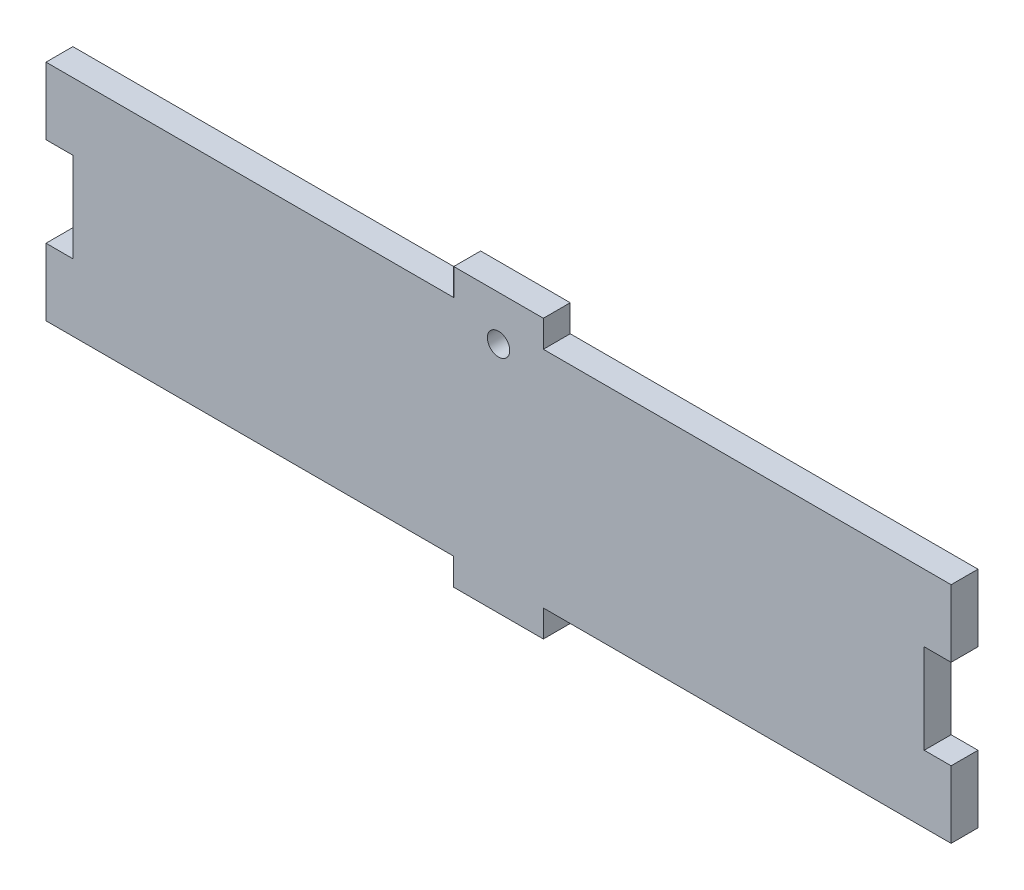
ISO-10303-21;
HEADER;
FILE_DESCRIPTION(('STEP AP214'),'2;1');
FILE_NAME('part.step','',(''),(''),'','','');
FILE_SCHEMA(('AUTOMOTIVE_DESIGN { 1 0 10303 214 1 1 1 1 }'));
ENDSEC;
DATA;
#1=APPLICATION_CONTEXT('core data for automotive mechanical design processes');
#2=APPLICATION_PROTOCOL_DEFINITION('international standard','automotive_design',2000,#1);
#3=PRODUCT_CONTEXT('',#1,'mechanical');
#4=PRODUCT('Part','Part','',(#3));
#5=PRODUCT_RELATED_PRODUCT_CATEGORY('part','',(#4));
#6=PRODUCT_DEFINITION_FORMATION('','',#4);
#7=PRODUCT_DEFINITION_CONTEXT('part definition',#1,'design');
#8=PRODUCT_DEFINITION('design','',#6,#7);
#9=PRODUCT_DEFINITION_SHAPE('','',#8);
#10=(LENGTH_UNIT() NAMED_UNIT(*) SI_UNIT(.MILLI.,.METRE.));
#11=(NAMED_UNIT(*) PLANE_ANGLE_UNIT() SI_UNIT($,.RADIAN.));
#12=(NAMED_UNIT(*) SI_UNIT($,.STERADIAN.) SOLID_ANGLE_UNIT());
#13=UNCERTAINTY_MEASURE_WITH_UNIT(LENGTH_MEASURE(1.E-05),#10,'distance_accuracy_value','');
#14=(GEOMETRIC_REPRESENTATION_CONTEXT(3) GLOBAL_UNCERTAINTY_ASSIGNED_CONTEXT((#13)) GLOBAL_UNIT_ASSIGNED_CONTEXT((#10,
#11,#12)) REPRESENTATION_CONTEXT('',''));
#15=CARTESIAN_POINT('',(0.,0.,0.));
#16=DIRECTION('',(0.,0.,1.));
#17=DIRECTION('',(1.,0.,0.));
#18=AXIS2_PLACEMENT_3D('',#15,#16,#17);
#19=CARTESIAN_POINT('',(-92.9969219106056,-12.7041554206809,-6.));
#20=DIRECTION('',(-1.,0.,0.));
#21=DIRECTION('',(0.,0.,1.));
#22=AXIS2_PLACEMENT_3D('',#19,#20,#21);
#23=PLANE('',#22);
#24=DIRECTION('',(0.,0.,1.));
#25=VECTOR('',#24,1.);
#26=CARTESIAN_POINT('',(-92.9969219106056,7.29584457931905,-6.));
#27=LINE('',#26,#25);
#28=CARTESIAN_POINT('',(-92.9969219106056,7.29584457931905,-6.));
#29=VERTEX_POINT('',#28);
#30=CARTESIAN_POINT('',(-92.9969219106056,7.29584457931905,0.));
#31=VERTEX_POINT('',#30);
#32=EDGE_CURVE('E191',#29,#31,#27,.T.);
#33=ORIENTED_EDGE('',*,*,#32,.F.);
#34=DIRECTION('',(0.,-1.,0.));
#35=VECTOR('',#34,1.);
#36=CARTESIAN_POINT('',(-92.9969219106056,22.2958445793191,-6.));
#37=LINE('',#36,#35);
#38=CARTESIAN_POINT('',(-92.9969219106056,-12.7041554206809,-6.));
#39=VERTEX_POINT('',#38);
#40=EDGE_CURVE('E49',#29,#39,#37,.T.);
#41=ORIENTED_EDGE('',*,*,#40,.T.);
#42=DIRECTION('',(0.,0.,1.));
#43=VECTOR('',#42,1.);
#44=CARTESIAN_POINT('',(-92.9969219106056,-12.7041554206809,-6.));
#45=LINE('',#44,#43);
#46=CARTESIAN_POINT('',(-92.9969219106056,-12.7041554206809,0.));
#47=VERTEX_POINT('',#46);
#48=EDGE_CURVE('E230',#39,#47,#45,.T.);
#49=ORIENTED_EDGE('',*,*,#48,.T.);
#50=DIRECTION('',(0.,-1.,0.));
#51=VECTOR('',#50,1.);
#52=CARTESIAN_POINT('',(-92.9969219106056,-12.7041554206809,0.));
#53=LINE('',#52,#51);
#54=EDGE_CURVE('E68',#31,#47,#53,.T.);
#55=ORIENTED_EDGE('',*,*,#54,.F.);
#56=EDGE_LOOP('',(#33,#41,#49,#55));
#57=FACE_BOUND('',#56,.T.);
#58=ADVANCED_FACE('F46',(#57),#23,.T.);
#59=CARTESIAN_POINT('',(97.0030780893944,-27.7041554206809,-6.));
#60=DIRECTION('',(0.,-1.,0.));
#61=DIRECTION('',(0.,0.,-1.));
#62=AXIS2_PLACEMENT_3D('',#59,#60,#61);
#63=PLANE('',#62);
#64=DIRECTION('',(1.,0.,0.));
#65=VECTOR('',#64,1.);
#66=CARTESIAN_POINT('',(-7.99692191060568,-27.7041554206809,-6.));
#67=LINE('',#66,#65);
#68=CARTESIAN_POINT('',(-98.9969219106057,-27.7041554206809,-6.));
#69=VERTEX_POINT('',#68);
#70=CARTESIAN_POINT('',(-7.99692191060568,-27.7041554206809,-6.));
#71=VERTEX_POINT('',#70);
#72=EDGE_CURVE('E55',#69,#71,#67,.T.);
#73=ORIENTED_EDGE('',*,*,#72,.T.);
#74=DIRECTION('',(0.,0.,1.));
#75=VECTOR('',#74,1.);
#76=CARTESIAN_POINT('',(-7.99692191060568,-27.7041554206809,-6.));
#77=LINE('',#76,#75);
#78=CARTESIAN_POINT('',(-7.99692191060568,-27.7041554206809,0.));
#79=VERTEX_POINT('',#78);
#80=EDGE_CURVE('E401',#71,#79,#77,.T.);
#81=ORIENTED_EDGE('',*,*,#80,.T.);
#82=DIRECTION('',(1.,0.,0.));
#83=VECTOR('',#82,1.);
#84=CARTESIAN_POINT('',(97.0030780893944,-27.7041554206809,0.));
#85=LINE('',#84,#83);
#86=CARTESIAN_POINT('',(-98.9969219106057,-27.7041554206809,0.));
#87=VERTEX_POINT('',#86);
#88=EDGE_CURVE('E256',#87,#79,#85,.T.);
#89=ORIENTED_EDGE('',*,*,#88,.F.);
#90=DIRECTION('',(0.,0.,1.));
#91=VECTOR('',#90,1.);
#92=CARTESIAN_POINT('',(-98.9969219106057,-27.7041554206809,-6.));
#93=LINE('',#92,#91);
#94=EDGE_CURVE('E227',#69,#87,#93,.T.);
#95=ORIENTED_EDGE('',*,*,#94,.F.);
#96=EDGE_LOOP('',(#73,#81,#89,#95));
#97=FACE_BOUND('',#96,.T.);
#98=ADVANCED_FACE('F425',(#97),#63,.T.);
#99=CARTESIAN_POINT('',(97.0030780893944,7.29584457931905,-6.));
#100=DIRECTION('',(1.,0.,0.));
#101=DIRECTION('',(0.,0.,-1.));
#102=AXIS2_PLACEMENT_3D('',#99,#100,#101);
#103=PLANE('',#102);
#104=DIRECTION('',(0.,0.,1.));
#105=VECTOR('',#104,1.);
#106=CARTESIAN_POINT('',(97.0030780893944,-12.7041554206809,-6.));
#107=LINE('',#106,#105);
#108=CARTESIAN_POINT('',(97.0030780893944,-12.7041554206809,-6.));
#109=VERTEX_POINT('',#108);
#110=CARTESIAN_POINT('',(97.0030780893944,-12.7041554206809,0.));
#111=VERTEX_POINT('',#110);
#112=EDGE_CURVE('E327',#109,#111,#107,.T.);
#113=ORIENTED_EDGE('',*,*,#112,.F.);
#114=DIRECTION('',(0.,1.,0.));
#115=VECTOR('',#114,1.);
#116=CARTESIAN_POINT('',(97.0030780893944,-27.7041554206809,-6.));
#117=LINE('',#116,#115);
#118=CARTESIAN_POINT('',(97.0030780893944,7.29584457931905,-6.));
#119=VERTEX_POINT('',#118);
#120=EDGE_CURVE('E13',#109,#119,#117,.T.);
#121=ORIENTED_EDGE('',*,*,#120,.T.);
#122=DIRECTION('',(0.,0.,1.));
#123=VECTOR('',#122,1.);
#124=CARTESIAN_POINT('',(97.0030780893944,7.29584457931905,-6.));
#125=LINE('',#124,#123);
#126=CARTESIAN_POINT('',(97.0030780893944,7.29584457931905,0.));
#127=VERTEX_POINT('',#126);
#128=EDGE_CURVE('E269',#119,#127,#125,.T.);
#129=ORIENTED_EDGE('',*,*,#128,.T.);
#130=DIRECTION('',(0.,1.,0.));
#131=VECTOR('',#130,1.);
#132=CARTESIAN_POINT('',(97.0030780893944,7.29584457931905,0.));
#133=LINE('',#132,#131);
#134=EDGE_CURVE('E258',#111,#127,#133,.T.);
#135=ORIENTED_EDGE('',*,*,#134,.F.);
#136=EDGE_LOOP('',(#113,#121,#129,#135));
#137=FACE_BOUND('',#136,.T.);
#138=ADVANCED_FACE('F450',(#137),#103,.T.);
#139=CARTESIAN_POINT('',(12.0030780893943,22.2958445793191,-6.));
#140=DIRECTION('',(0.,1.,0.));
#141=DIRECTION('',(0.,0.,1.));
#142=AXIS2_PLACEMENT_3D('',#139,#140,#141);
#143=PLANE('',#142);
#144=DIRECTION('',(-1.,0.,0.));
#145=VECTOR('',#144,1.);
#146=CARTESIAN_POINT('',(-92.9969219106056,22.2958445793191,-6.));
#147=LINE('',#146,#145);
#148=CARTESIAN_POINT('',(103.003078089394,22.2958445793191,-6.));
#149=VERTEX_POINT('',#148);
#150=CARTESIAN_POINT('',(12.0030780893943,22.2958445793191,-6.));
#151=VERTEX_POINT('',#150);
#152=EDGE_CURVE('E355',#149,#151,#147,.T.);
#153=ORIENTED_EDGE('',*,*,#152,.T.);
#154=DIRECTION('',(0.,0.,1.));
#155=VECTOR('',#154,1.);
#156=CARTESIAN_POINT('',(12.0030780893943,22.2958445793191,-6.));
#157=LINE('',#156,#155);
#158=CARTESIAN_POINT('',(12.0030780893943,22.2958445793191,0.));
#159=VERTEX_POINT('',#158);
#160=EDGE_CURVE('E242',#151,#159,#157,.T.);
#161=ORIENTED_EDGE('',*,*,#160,.T.);
#162=DIRECTION('',(-1.,0.,0.));
#163=VECTOR('',#162,1.);
#164=CARTESIAN_POINT('',(12.0030780893943,22.2958445793191,0.));
#165=LINE('',#164,#163);
#166=CARTESIAN_POINT('',(103.003078089394,22.2958445793191,0.));
#167=VERTEX_POINT('',#166);
#168=EDGE_CURVE('E351',#167,#159,#165,.T.);
#169=ORIENTED_EDGE('',*,*,#168,.F.);
#170=DIRECTION('',(0.,0.,1.));
#171=VECTOR('',#170,1.);
#172=CARTESIAN_POINT('',(103.003078089394,22.2958445793191,-6.));
#173=LINE('',#172,#171);
#174=EDGE_CURVE('E337',#149,#167,#173,.T.);
#175=ORIENTED_EDGE('',*,*,#174,.F.);
#176=EDGE_LOOP('',(#153,#161,#169,#175));
#177=FACE_BOUND('',#176,.T.);
#178=ADVANCED_FACE('F453',(#177),#143,.T.);
#179=DIRECTION('',(0.,0.,1.));
#180=VECTOR('',#179,1.);
#181=CARTESIAN_POINT('',(-7.99692191060566,22.2958445793191,-6.));
#182=LINE('',#181,#180);
#183=CARTESIAN_POINT('',(-7.99692191060566,22.2958445793191,-6.));
#184=VERTEX_POINT('',#183);
#185=CARTESIAN_POINT('',(-7.99692191060566,22.2958445793191,0.));
#186=VERTEX_POINT('',#185);
#187=EDGE_CURVE('E298',#184,#186,#182,.T.);
#188=ORIENTED_EDGE('',*,*,#187,.F.);
#189=CARTESIAN_POINT('',(-98.9969219106057,22.2958445793191,-6.));
#190=VERTEX_POINT('',#189);
#191=EDGE_CURVE('E353',#184,#190,#147,.T.);
#192=ORIENTED_EDGE('',*,*,#191,.T.);
#193=DIRECTION('',(0.,0.,1.));
#194=VECTOR('',#193,1.);
#195=CARTESIAN_POINT('',(-98.9969219106057,22.2958445793191,-6.));
#196=LINE('',#195,#194);
#197=CARTESIAN_POINT('',(-98.9969219106057,22.2958445793191,0.));
#198=VERTEX_POINT('',#197);
#199=EDGE_CURVE('E204',#190,#198,#196,.T.);
#200=ORIENTED_EDGE('',*,*,#199,.T.);
#201=EDGE_CURVE('E261',#186,#198,#165,.T.);
#202=ORIENTED_EDGE('',*,*,#201,.F.);
#203=EDGE_LOOP('',(#188,#192,#200,#202));
#204=FACE_BOUND('',#203,.T.);
#205=ADVANCED_FACE('F455',(#204),#143,.T.);
#206=DIRECTION('',(0.,0.,1.));
#207=VECTOR('',#206,1.);
#208=CARTESIAN_POINT('',(12.0030780893943,-27.7041554206809,-6.));
#209=LINE('',#208,#207);
#210=CARTESIAN_POINT('',(12.0030780893943,-27.7041554206809,-6.));
#211=VERTEX_POINT('',#210);
#212=CARTESIAN_POINT('',(12.0030780893943,-27.7041554206809,0.));
#213=VERTEX_POINT('',#212);
#214=EDGE_CURVE('E409',#211,#213,#209,.T.);
#215=ORIENTED_EDGE('',*,*,#214,.F.);
#216=CARTESIAN_POINT('',(103.003078089394,-27.7041554206809,-6.));
#217=VERTEX_POINT('',#216);
#218=EDGE_CURVE('E369',#211,#217,#67,.T.);
#219=ORIENTED_EDGE('',*,*,#218,.T.);
#220=DIRECTION('',(0.,0.,1.));
#221=VECTOR('',#220,1.);
#222=CARTESIAN_POINT('',(103.003078089394,-27.7041554206809,-6.));
#223=LINE('',#222,#221);
#224=CARTESIAN_POINT('',(103.003078089394,-27.7041554206809,0.));
#225=VERTEX_POINT('',#224);
#226=EDGE_CURVE('E320',#217,#225,#223,.T.);
#227=ORIENTED_EDGE('',*,*,#226,.T.);
#228=EDGE_CURVE('E241',#213,#225,#85,.T.);
#229=ORIENTED_EDGE('',*,*,#228,.F.);
#230=EDGE_LOOP('',(#215,#219,#227,#229));
#231=FACE_BOUND('',#230,.T.);
#232=ADVANCED_FACE('F437',(#231),#63,.T.);
#233=CARTESIAN_POINT('',(0.,0.,-6.));
#234=DIRECTION('',(0.,0.,1.));
#235=DIRECTION('',(1.,0.,0.));
#236=AXIS2_PLACEMENT_3D('',#233,#234,#235);
#237=PLANE('',#236);
#238=CARTESIAN_POINT('',(2.0030780893944,18.2958445793191,-6.));
#239=DIRECTION('',(0.,0.,1.));
#240=DIRECTION('',(1.,0.,0.));
#241=AXIS2_PLACEMENT_3D('',#238,#239,#240);
#242=CIRCLE('',#241,2.5);
#243=CARTESIAN_POINT('',(4.5030780893944,18.2958445793191,-6.));
#244=VERTEX_POINT('',#243);
#245=EDGE_CURVE('E212',#244,#244,#242,.T.);
#246=ORIENTED_EDGE('',*,*,#245,.T.);
#247=EDGE_LOOP('',(#246));
#248=FACE_BOUND('',#247,.T.);
#249=ORIENTED_EDGE('',*,*,#152,.F.);
#250=DIRECTION('',(0.,1.,0.));
#251=VECTOR('',#250,1.);
#252=CARTESIAN_POINT('',(103.003078089394,7.29584457931905,-6.));
#253=LINE('',#252,#251);
#254=CARTESIAN_POINT('',(103.003078089394,7.29584457931905,-6.));
#255=VERTEX_POINT('',#254);
#256=EDGE_CURVE('E267',#255,#149,#253,.T.);
#257=ORIENTED_EDGE('',*,*,#256,.F.);
#258=DIRECTION('',(1.,0.,0.));
#259=VECTOR('',#258,1.);
#260=CARTESIAN_POINT('',(97.0030780893944,7.29584457931905,-6.));
#261=LINE('',#260,#259);
#262=EDGE_CURVE('E264',#119,#255,#261,.T.);
#263=ORIENTED_EDGE('',*,*,#262,.F.);
#264=ORIENTED_EDGE('',*,*,#120,.F.);
#265=DIRECTION('',(-1.,0.,0.));
#266=VECTOR('',#265,1.);
#267=CARTESIAN_POINT('',(103.003078089394,-12.7041554206809,-6.));
#268=LINE('',#267,#266);
#269=CARTESIAN_POINT('',(103.003078089394,-12.7041554206809,-6.));
#270=VERTEX_POINT('',#269);
#271=EDGE_CURVE('E440',#270,#109,#268,.T.);
#272=ORIENTED_EDGE('',*,*,#271,.F.);
#273=DIRECTION('',(0.,1.,0.));
#274=VECTOR('',#273,1.);
#275=CARTESIAN_POINT('',(103.003078089394,-27.7041554206809,-6.));
#276=LINE('',#275,#274);
#277=EDGE_CURVE('E335',#217,#270,#276,.T.);
#278=ORIENTED_EDGE('',*,*,#277,.F.);
#279=ORIENTED_EDGE('',*,*,#218,.F.);
#280=DIRECTION('',(0.,1.,0.));
#281=VECTOR('',#280,1.);
#282=CARTESIAN_POINT('',(12.0030780893943,-33.7041554206809,-6.));
#283=LINE('',#282,#281);
#284=CARTESIAN_POINT('',(12.0030780893943,-33.7041554206809,-6.));
#285=VERTEX_POINT('',#284);
#286=EDGE_CURVE('E393',#285,#211,#283,.T.);
#287=ORIENTED_EDGE('',*,*,#286,.F.);
#288=DIRECTION('',(1.,0.,0.));
#289=VECTOR('',#288,1.);
#290=CARTESIAN_POINT('',(-7.99692191060568,-33.7041554206809,-6.));
#291=LINE('',#290,#289);
#292=CARTESIAN_POINT('',(-7.99692191060568,-33.7041554206809,-6.));
#293=VERTEX_POINT('',#292);
#294=EDGE_CURVE('E390',#293,#285,#291,.T.);
#295=ORIENTED_EDGE('',*,*,#294,.F.);
#296=DIRECTION('',(0.,-1.,0.));
#297=VECTOR('',#296,1.);
#298=CARTESIAN_POINT('',(-7.99692191060568,-27.7041554206809,-6.));
#299=LINE('',#298,#297);
#300=EDGE_CURVE('E411',#71,#293,#299,.T.);
#301=ORIENTED_EDGE('',*,*,#300,.F.);
#302=ORIENTED_EDGE('',*,*,#72,.F.);
#303=DIRECTION('',(0.,-1.,0.));
#304=VECTOR('',#303,1.);
#305=CARTESIAN_POINT('',(-98.9969219106057,-12.7041554206809,-6.));
#306=LINE('',#305,#304);
#307=CARTESIAN_POINT('',(-98.9969219106057,-12.7041554206809,-6.));
#308=VERTEX_POINT('',#307);
#309=EDGE_CURVE('E217',#308,#69,#306,.T.);
#310=ORIENTED_EDGE('',*,*,#309,.F.);
#311=DIRECTION('',(-1.,0.,0.));
#312=VECTOR('',#311,1.);
#313=CARTESIAN_POINT('',(-92.9969219106056,-12.7041554206809,-6.));
#314=LINE('',#313,#312);
#315=EDGE_CURVE('E221',#39,#308,#314,.T.);
#316=ORIENTED_EDGE('',*,*,#315,.F.);
#317=ORIENTED_EDGE('',*,*,#40,.F.);
#318=DIRECTION('',(1.,0.,0.));
#319=VECTOR('',#318,1.);
#320=CARTESIAN_POINT('',(-98.9969219106057,7.29584457931905,-6.));
#321=LINE('',#320,#319);
#322=CARTESIAN_POINT('',(-98.9969219106057,7.29584457931905,-6.));
#323=VERTEX_POINT('',#322);
#324=EDGE_CURVE('E186',#323,#29,#321,.T.);
#325=ORIENTED_EDGE('',*,*,#324,.F.);
#326=DIRECTION('',(0.,-1.,0.));
#327=VECTOR('',#326,1.);
#328=CARTESIAN_POINT('',(-98.9969219106057,22.2958445793191,-6.));
#329=LINE('',#328,#327);
#330=EDGE_CURVE('E198',#190,#323,#329,.T.);
#331=ORIENTED_EDGE('',*,*,#330,.F.);
#332=ORIENTED_EDGE('',*,*,#191,.F.);
#333=DIRECTION('',(0.,-1.,0.));
#334=VECTOR('',#333,1.);
#335=CARTESIAN_POINT('',(-7.99692191060565,28.2958445793191,-6.));
#336=LINE('',#335,#334);
#337=CARTESIAN_POINT('',(-7.99692191060565,28.2958445793191,-6.));
#338=VERTEX_POINT('',#337);
#339=EDGE_CURVE('E283',#338,#184,#336,.T.);
#340=ORIENTED_EDGE('',*,*,#339,.F.);
#341=DIRECTION('',(-1.,0.,0.));
#342=VECTOR('',#341,1.);
#343=CARTESIAN_POINT('',(12.0030780893943,28.2958445793191,-6.));
#344=LINE('',#343,#342);
#345=CARTESIAN_POINT('',(12.0030780893943,28.2958445793191,-6.));
#346=VERTEX_POINT('',#345);
#347=EDGE_CURVE('E280',#346,#338,#344,.T.);
#348=ORIENTED_EDGE('',*,*,#347,.F.);
#349=DIRECTION('',(0.,1.,0.));
#350=VECTOR('',#349,1.);
#351=CARTESIAN_POINT('',(12.0030780893943,22.2958445793191,-6.));
#352=LINE('',#351,#350);
#353=EDGE_CURVE('E284',#151,#346,#352,.T.);
#354=ORIENTED_EDGE('',*,*,#353,.F.);
#355=EDGE_LOOP('',(#249,#257,#263,#264,#272,#278,#279,#287,#295,#301,#302,#310,#316,#317,#325,
#331,#332,#340,#348,#354));
#356=FACE_BOUND('',#355,.T.);
#357=ADVANCED_FACE('F196',(#248,#356),#237,.F.);
#358=CARTESIAN_POINT('',(0.,0.,0.));
#359=DIRECTION('',(0.,0.,1.));
#360=DIRECTION('',(1.,0.,0.));
#361=AXIS2_PLACEMENT_3D('',#358,#359,#360);
#362=PLANE('',#361);
#363=CARTESIAN_POINT('',(2.0030780893944,18.2958445793191,0.));
#364=DIRECTION('',(0.,0.,1.));
#365=DIRECTION('',(1.,0.,0.));
#366=AXIS2_PLACEMENT_3D('',#363,#364,#365);
#367=CIRCLE('',#366,2.5);
#368=CARTESIAN_POINT('',(4.5030780893944,18.2958445793191,0.));
#369=VERTEX_POINT('',#368);
#370=EDGE_CURVE('E209',#369,#369,#367,.T.);
#371=ORIENTED_EDGE('',*,*,#370,.F.);
#372=EDGE_LOOP('',(#371));
#373=FACE_BOUND('',#372,.T.);
#374=ORIENTED_EDGE('',*,*,#168,.T.);
#375=DIRECTION('',(0.,1.,0.));
#376=VECTOR('',#375,1.);
#377=CARTESIAN_POINT('',(12.0030780893943,22.2958445793191,0.));
#378=LINE('',#377,#376);
#379=CARTESIAN_POINT('',(12.0030780893943,28.2958445793191,0.));
#380=VERTEX_POINT('',#379);
#381=EDGE_CURVE('E289',#159,#380,#378,.T.);
#382=ORIENTED_EDGE('',*,*,#381,.T.);
#383=DIRECTION('',(-1.,0.,0.));
#384=VECTOR('',#383,1.);
#385=CARTESIAN_POINT('',(12.0030780893943,28.2958445793191,0.));
#386=LINE('',#385,#384);
#387=CARTESIAN_POINT('',(-7.99692191060565,28.2958445793191,0.));
#388=VERTEX_POINT('',#387);
#389=EDGE_CURVE('E285',#380,#388,#386,.T.);
#390=ORIENTED_EDGE('',*,*,#389,.T.);
#391=DIRECTION('',(0.,-1.,0.));
#392=VECTOR('',#391,1.);
#393=CARTESIAN_POINT('',(-7.99692191060565,28.2958445793191,0.));
#394=LINE('',#393,#392);
#395=EDGE_CURVE('E288',#388,#186,#394,.T.);
#396=ORIENTED_EDGE('',*,*,#395,.T.);
#397=ORIENTED_EDGE('',*,*,#201,.T.);
#398=DIRECTION('',(0.,-1.,0.));
#399=VECTOR('',#398,1.);
#400=CARTESIAN_POINT('',(-98.9969219106057,22.2958445793191,0.));
#401=LINE('',#400,#399);
#402=CARTESIAN_POINT('',(-98.9969219106057,7.29584457931905,0.));
#403=VERTEX_POINT('',#402);
#404=EDGE_CURVE('E206',#198,#403,#401,.T.);
#405=ORIENTED_EDGE('',*,*,#404,.T.);
#406=DIRECTION('',(1.,0.,0.));
#407=VECTOR('',#406,1.);
#408=CARTESIAN_POINT('',(-98.9969219106057,7.29584457931905,0.));
#409=LINE('',#408,#407);
#410=EDGE_CURVE('E63',#403,#31,#409,.T.);
#411=ORIENTED_EDGE('',*,*,#410,.T.);
#412=ORIENTED_EDGE('',*,*,#54,.T.);
#413=DIRECTION('',(-1.,0.,0.));
#414=VECTOR('',#413,1.);
#415=CARTESIAN_POINT('',(-92.9969219106056,-12.7041554206809,0.));
#416=LINE('',#415,#414);
#417=CARTESIAN_POINT('',(-98.9969219106057,-12.7041554206809,0.));
#418=VERTEX_POINT('',#417);
#419=EDGE_CURVE('E215',#47,#418,#416,.T.);
#420=ORIENTED_EDGE('',*,*,#419,.T.);
#421=DIRECTION('',(0.,-1.,0.));
#422=VECTOR('',#421,1.);
#423=CARTESIAN_POINT('',(-98.9969219106057,-12.7041554206809,0.));
#424=LINE('',#423,#422);
#425=EDGE_CURVE('E222',#418,#87,#424,.T.);
#426=ORIENTED_EDGE('',*,*,#425,.T.);
#427=ORIENTED_EDGE('',*,*,#88,.T.);
#428=DIRECTION('',(0.,-1.,0.));
#429=VECTOR('',#428,1.);
#430=CARTESIAN_POINT('',(-7.99692191060568,-27.7041554206809,0.));
#431=LINE('',#430,#429);
#432=CARTESIAN_POINT('',(-7.99692191060568,-33.7041554206809,0.));
#433=VERTEX_POINT('',#432);
#434=EDGE_CURVE('E394',#79,#433,#431,.T.);
#435=ORIENTED_EDGE('',*,*,#434,.T.);
#436=DIRECTION('',(1.,0.,0.));
#437=VECTOR('',#436,1.);
#438=CARTESIAN_POINT('',(-7.99692191060568,-33.7041554206809,0.));
#439=LINE('',#438,#437);
#440=CARTESIAN_POINT('',(12.0030780893943,-33.7041554206809,0.));
#441=VERTEX_POINT('',#440);
#442=EDGE_CURVE('E234',#433,#441,#439,.T.);
#443=ORIENTED_EDGE('',*,*,#442,.T.);
#444=DIRECTION('',(0.,1.,0.));
#445=VECTOR('',#444,1.);
#446=CARTESIAN_POINT('',(12.0030780893943,-33.7041554206809,0.));
#447=LINE('',#446,#445);
#448=EDGE_CURVE('E397',#441,#213,#447,.T.);
#449=ORIENTED_EDGE('',*,*,#448,.T.);
#450=ORIENTED_EDGE('',*,*,#228,.T.);
#451=DIRECTION('',(0.,1.,0.));
#452=VECTOR('',#451,1.);
#453=CARTESIAN_POINT('',(103.003078089394,-27.7041554206809,0.));
#454=LINE('',#453,#452);
#455=CARTESIAN_POINT('',(103.003078089394,-12.7041554206809,0.));
#456=VERTEX_POINT('',#455);
#457=EDGE_CURVE('E330',#225,#456,#454,.T.);
#458=ORIENTED_EDGE('',*,*,#457,.T.);
#459=DIRECTION('',(-1.,0.,0.));
#460=VECTOR('',#459,1.);
#461=CARTESIAN_POINT('',(103.003078089394,-12.7041554206809,0.));
#462=LINE('',#461,#460);
#463=EDGE_CURVE('E400',#456,#111,#462,.T.);
#464=ORIENTED_EDGE('',*,*,#463,.T.);
#465=ORIENTED_EDGE('',*,*,#134,.T.);
#466=DIRECTION('',(1.,0.,0.));
#467=VECTOR('',#466,1.);
#468=CARTESIAN_POINT('',(97.0030780893944,7.29584457931905,0.));
#469=LINE('',#468,#467);
#470=CARTESIAN_POINT('',(103.003078089394,7.29584457931905,0.));
#471=VERTEX_POINT('',#470);
#472=EDGE_CURVE('E314',#127,#471,#469,.T.);
#473=ORIENTED_EDGE('',*,*,#472,.T.);
#474=DIRECTION('',(0.,1.,0.));
#475=VECTOR('',#474,1.);
#476=CARTESIAN_POINT('',(103.003078089394,7.29584457931905,0.));
#477=LINE('',#476,#475);
#478=EDGE_CURVE('E268',#471,#167,#477,.T.);
#479=ORIENTED_EDGE('',*,*,#478,.T.);
#480=EDGE_LOOP('',(#374,#382,#390,#396,#397,#405,#411,#412,#420,#426,#427,#435,#443,#449,#450,
#458,#464,#465,#473,#479));
#481=FACE_BOUND('',#480,.T.);
#482=ADVANCED_FACE('F350',(#373,#481),#362,.T.);
#483=CARTESIAN_POINT('',(12.0030780893943,22.2958445793191,-6.));
#484=DIRECTION('',(1.,0.,0.));
#485=DIRECTION('',(0.,1.,0.));
#486=AXIS2_PLACEMENT_3D('',#483,#484,#485);
#487=PLANE('',#486);
#488=ORIENTED_EDGE('',*,*,#381,.F.);
#489=ORIENTED_EDGE('',*,*,#160,.F.);
#490=ORIENTED_EDGE('',*,*,#353,.T.);
#491=DIRECTION('',(0.,0.,1.));
#492=VECTOR('',#491,1.);
#493=CARTESIAN_POINT('',(12.0030780893943,28.2958445793191,-6.));
#494=LINE('',#493,#492);
#495=EDGE_CURVE('E308',#346,#380,#494,.T.);
#496=ORIENTED_EDGE('',*,*,#495,.T.);
#497=EDGE_LOOP('',(#488,#489,#490,#496));
#498=FACE_BOUND('',#497,.T.);
#499=ADVANCED_FACE('F479',(#498),#487,.T.);
#500=CARTESIAN_POINT('',(-7.99692191060565,28.2958445793191,-6.));
#501=DIRECTION('',(-1.,0.,0.));
#502=DIRECTION('',(0.,-1.,0.));
#503=AXIS2_PLACEMENT_3D('',#500,#501,#502);
#504=PLANE('',#503);
#505=ORIENTED_EDGE('',*,*,#395,.F.);
#506=DIRECTION('',(0.,0.,1.));
#507=VECTOR('',#506,1.);
#508=CARTESIAN_POINT('',(-7.99692191060565,28.2958445793191,-6.));
#509=LINE('',#508,#507);
#510=EDGE_CURVE('E306',#338,#388,#509,.T.);
#511=ORIENTED_EDGE('',*,*,#510,.F.);
#512=ORIENTED_EDGE('',*,*,#339,.T.);
#513=ORIENTED_EDGE('',*,*,#187,.T.);
#514=EDGE_LOOP('',(#505,#511,#512,#513));
#515=FACE_BOUND('',#514,.T.);
#516=ADVANCED_FACE('F485',(#515),#504,.T.);
#517=CARTESIAN_POINT('',(12.0030780893943,28.2958445793191,-6.));
#518=DIRECTION('',(0.,1.,0.));
#519=DIRECTION('',(0.,0.,1.));
#520=AXIS2_PLACEMENT_3D('',#517,#518,#519);
#521=PLANE('',#520);
#522=ORIENTED_EDGE('',*,*,#389,.F.);
#523=ORIENTED_EDGE('',*,*,#495,.F.);
#524=ORIENTED_EDGE('',*,*,#347,.T.);
#525=ORIENTED_EDGE('',*,*,#510,.T.);
#526=EDGE_LOOP('',(#522,#523,#524,#525));
#527=FACE_BOUND('',#526,.T.);
#528=ADVANCED_FACE('F487',(#527),#521,.T.);
#529=CARTESIAN_POINT('',(103.003078089394,7.29584457931905,-6.));
#530=DIRECTION('',(1.,0.,0.));
#531=DIRECTION('',(0.,0.,-1.));
#532=AXIS2_PLACEMENT_3D('',#529,#530,#531);
#533=PLANE('',#532);
#534=ORIENTED_EDGE('',*,*,#478,.F.);
#535=DIRECTION('',(0.,0.,1.));
#536=VECTOR('',#535,1.);
#537=CARTESIAN_POINT('',(103.003078089394,7.29584457931905,-6.));
#538=LINE('',#537,#536);
#539=EDGE_CURVE('E273',#255,#471,#538,.T.);
#540=ORIENTED_EDGE('',*,*,#539,.F.);
#541=ORIENTED_EDGE('',*,*,#256,.T.);
#542=ORIENTED_EDGE('',*,*,#174,.T.);
#543=EDGE_LOOP('',(#534,#540,#541,#542));
#544=FACE_BOUND('',#543,.T.);
#545=ADVANCED_FACE('F348',(#544),#533,.T.);
#546=CARTESIAN_POINT('',(97.0030780893944,7.29584457931905,-6.));
#547=DIRECTION('',(0.,-1.,0.));
#548=DIRECTION('',(0.,0.,-1.));
#549=AXIS2_PLACEMENT_3D('',#546,#547,#548);
#550=PLANE('',#549);
#551=ORIENTED_EDGE('',*,*,#472,.F.);
#552=ORIENTED_EDGE('',*,*,#128,.F.);
#553=ORIENTED_EDGE('',*,*,#262,.T.);
#554=ORIENTED_EDGE('',*,*,#539,.T.);
#555=EDGE_LOOP('',(#551,#552,#553,#554));
#556=FACE_BOUND('',#555,.T.);
#557=ADVANCED_FACE('F344',(#556),#550,.T.);
#558=CARTESIAN_POINT('',(103.003078089394,-12.7041554206809,-6.));
#559=DIRECTION('',(0.,1.,0.));
#560=DIRECTION('',(-1.,0.,0.));
#561=AXIS2_PLACEMENT_3D('',#558,#559,#560);
#562=PLANE('',#561);
#563=ORIENTED_EDGE('',*,*,#463,.F.);
#564=DIRECTION('',(0.,0.,1.));
#565=VECTOR('',#564,1.);
#566=CARTESIAN_POINT('',(103.003078089394,-12.7041554206809,-6.));
#567=LINE('',#566,#565);
#568=EDGE_CURVE('E316',#270,#456,#567,.T.);
#569=ORIENTED_EDGE('',*,*,#568,.F.);
#570=ORIENTED_EDGE('',*,*,#271,.T.);
#571=ORIENTED_EDGE('',*,*,#112,.T.);
#572=EDGE_LOOP('',(#563,#569,#570,#571));
#573=FACE_BOUND('',#572,.T.);
#574=ADVANCED_FACE('F447',(#573),#562,.T.);
#575=CARTESIAN_POINT('',(103.003078089394,-27.7041554206809,-6.));
#576=DIRECTION('',(1.,0.,0.));
#577=DIRECTION('',(0.,1.,0.));
#578=AXIS2_PLACEMENT_3D('',#575,#576,#577);
#579=PLANE('',#578);
#580=ORIENTED_EDGE('',*,*,#457,.F.);
#581=ORIENTED_EDGE('',*,*,#226,.F.);
#582=ORIENTED_EDGE('',*,*,#277,.T.);
#583=ORIENTED_EDGE('',*,*,#568,.T.);
#584=EDGE_LOOP('',(#580,#581,#582,#583));
#585=FACE_BOUND('',#584,.T.);
#586=ADVANCED_FACE('F439',(#585),#579,.T.);
#587=CARTESIAN_POINT('',(-7.99692191060568,-33.7041554206809,-6.));
#588=DIRECTION('',(0.,-1.,0.));
#589=DIRECTION('',(0.,0.,-1.));
#590=AXIS2_PLACEMENT_3D('',#587,#588,#589);
#591=PLANE('',#590);
#592=ORIENTED_EDGE('',*,*,#442,.F.);
#593=DIRECTION('',(0.,0.,1.));
#594=VECTOR('',#593,1.);
#595=CARTESIAN_POINT('',(-7.99692191060568,-33.7041554206809,-6.));
#596=LINE('',#595,#594);
#597=EDGE_CURVE('E398',#293,#433,#596,.T.);
#598=ORIENTED_EDGE('',*,*,#597,.F.);
#599=ORIENTED_EDGE('',*,*,#294,.T.);
#600=DIRECTION('',(0.,0.,1.));
#601=VECTOR('',#600,1.);
#602=CARTESIAN_POINT('',(12.0030780893943,-33.7041554206809,-6.));
#603=LINE('',#602,#601);
#604=EDGE_CURVE('E414',#285,#441,#603,.T.);
#605=ORIENTED_EDGE('',*,*,#604,.T.);
#606=EDGE_LOOP('',(#592,#598,#599,#605));
#607=FACE_BOUND('',#606,.T.);
#608=ADVANCED_FACE('F432',(#607),#591,.T.);
#609=CARTESIAN_POINT('',(-7.99692191060568,-27.7041554206809,-6.));
#610=DIRECTION('',(-1.,0.,0.));
#611=DIRECTION('',(0.,0.,1.));
#612=AXIS2_PLACEMENT_3D('',#609,#610,#611);
#613=PLANE('',#612);
#614=ORIENTED_EDGE('',*,*,#434,.F.);
#615=ORIENTED_EDGE('',*,*,#80,.F.);
#616=ORIENTED_EDGE('',*,*,#300,.T.);
#617=ORIENTED_EDGE('',*,*,#597,.T.);
#618=EDGE_LOOP('',(#614,#615,#616,#617));
#619=FACE_BOUND('',#618,.T.);
#620=ADVANCED_FACE('F427',(#619),#613,.T.);
#621=CARTESIAN_POINT('',(12.0030780893943,-33.7041554206809,-6.));
#622=DIRECTION('',(1.,0.,0.));
#623=DIRECTION('',(0.,1.,0.));
#624=AXIS2_PLACEMENT_3D('',#621,#622,#623);
#625=PLANE('',#624);
#626=ORIENTED_EDGE('',*,*,#448,.F.);
#627=ORIENTED_EDGE('',*,*,#604,.F.);
#628=ORIENTED_EDGE('',*,*,#286,.T.);
#629=ORIENTED_EDGE('',*,*,#214,.T.);
#630=EDGE_LOOP('',(#626,#627,#628,#629));
#631=FACE_BOUND('',#630,.T.);
#632=ADVANCED_FACE('F504',(#631),#625,.T.);
#633=CARTESIAN_POINT('',(-92.9969219106056,-12.7041554206809,-6.));
#634=DIRECTION('',(0.,1.,0.));
#635=DIRECTION('',(-1.,0.,0.));
#636=AXIS2_PLACEMENT_3D('',#633,#634,#635);
#637=PLANE('',#636);
#638=ORIENTED_EDGE('',*,*,#419,.F.);
#639=ORIENTED_EDGE('',*,*,#48,.F.);
#640=ORIENTED_EDGE('',*,*,#315,.T.);
#641=DIRECTION('',(0.,0.,1.));
#642=VECTOR('',#641,1.);
#643=CARTESIAN_POINT('',(-98.9969219106057,-12.7041554206809,-6.));
#644=LINE('',#643,#642);
#645=EDGE_CURVE('E220',#308,#418,#644,.T.);
#646=ORIENTED_EDGE('',*,*,#645,.T.);
#647=EDGE_LOOP('',(#638,#639,#640,#646));
#648=FACE_BOUND('',#647,.T.);
#649=ADVANCED_FACE('F382',(#648),#637,.T.);
#650=CARTESIAN_POINT('',(-98.9969219106057,-12.7041554206809,-6.));
#651=DIRECTION('',(-1.,0.,0.));
#652=DIRECTION('',(0.,-1.,0.));
#653=AXIS2_PLACEMENT_3D('',#650,#651,#652);
#654=PLANE('',#653);
#655=ORIENTED_EDGE('',*,*,#425,.F.);
#656=ORIENTED_EDGE('',*,*,#645,.F.);
#657=ORIENTED_EDGE('',*,*,#309,.T.);
#658=ORIENTED_EDGE('',*,*,#94,.T.);
#659=EDGE_LOOP('',(#655,#656,#657,#658));
#660=FACE_BOUND('',#659,.T.);
#661=ADVANCED_FACE('F388',(#660),#654,.T.);
#662=CARTESIAN_POINT('',(-98.9969219106057,22.2958445793191,-6.));
#663=DIRECTION('',(-1.,0.,0.));
#664=DIRECTION('',(0.,0.,1.));
#665=AXIS2_PLACEMENT_3D('',#662,#663,#664);
#666=PLANE('',#665);
#667=ORIENTED_EDGE('',*,*,#404,.F.);
#668=ORIENTED_EDGE('',*,*,#199,.F.);
#669=ORIENTED_EDGE('',*,*,#330,.T.);
#670=DIRECTION('',(0.,0.,1.));
#671=VECTOR('',#670,1.);
#672=CARTESIAN_POINT('',(-98.9969219106057,7.29584457931905,-6.));
#673=LINE('',#672,#671);
#674=EDGE_CURVE('E183',#323,#403,#673,.T.);
#675=ORIENTED_EDGE('',*,*,#674,.T.);
#676=EDGE_LOOP('',(#667,#668,#669,#675));
#677=FACE_BOUND('',#676,.T.);
#678=ADVANCED_FACE('F202',(#677),#666,.T.);
#679=CARTESIAN_POINT('',(-98.9969219106057,7.29584457931905,-6.));
#680=DIRECTION('',(0.,-1.,0.));
#681=DIRECTION('',(0.,0.,-1.));
#682=AXIS2_PLACEMENT_3D('',#679,#680,#681);
#683=PLANE('',#682);
#684=ORIENTED_EDGE('',*,*,#410,.F.);
#685=ORIENTED_EDGE('',*,*,#674,.F.);
#686=ORIENTED_EDGE('',*,*,#324,.T.);
#687=ORIENTED_EDGE('',*,*,#32,.T.);
#688=EDGE_LOOP('',(#684,#685,#686,#687));
#689=FACE_BOUND('',#688,.T.);
#690=ADVANCED_FACE('F185',(#689),#683,.T.);
#691=CARTESIAN_POINT('',(2.0030780893944,18.2958445793191,-6.));
#692=DIRECTION('',(0.,0.,1.));
#693=DIRECTION('',(1.,0.,0.));
#694=AXIS2_PLACEMENT_3D('',#691,#692,#693);
#695=CYLINDRICAL_SURFACE('',#694,2.5);
#696=ORIENTED_EDGE('',*,*,#245,.F.);
#697=EDGE_LOOP('',(#696));
#698=FACE_BOUND('',#697,.T.);
#699=ORIENTED_EDGE('',*,*,#370,.T.);
#700=EDGE_LOOP('',(#699));
#701=FACE_BOUND('',#700,.T.);
#702=ADVANCED_FACE('F517',(#698,#701),#695,.F.);
#703=CLOSED_SHELL('',(#58,#98,#138,#178,#205,#232,#357,#482,#499,#516,#528,#545,#557,#574,#586,
#608,#620,#632,#649,#661,#678,#690,#702));
#704=MANIFOLD_SOLID_BREP('B2',#703);
#705=ADVANCED_BREP_SHAPE_REPRESENTATION('',(#18,#704),#14);
#706=SHAPE_DEFINITION_REPRESENTATION(#9,#705);
ENDSEC;
END-ISO-10303-21;
